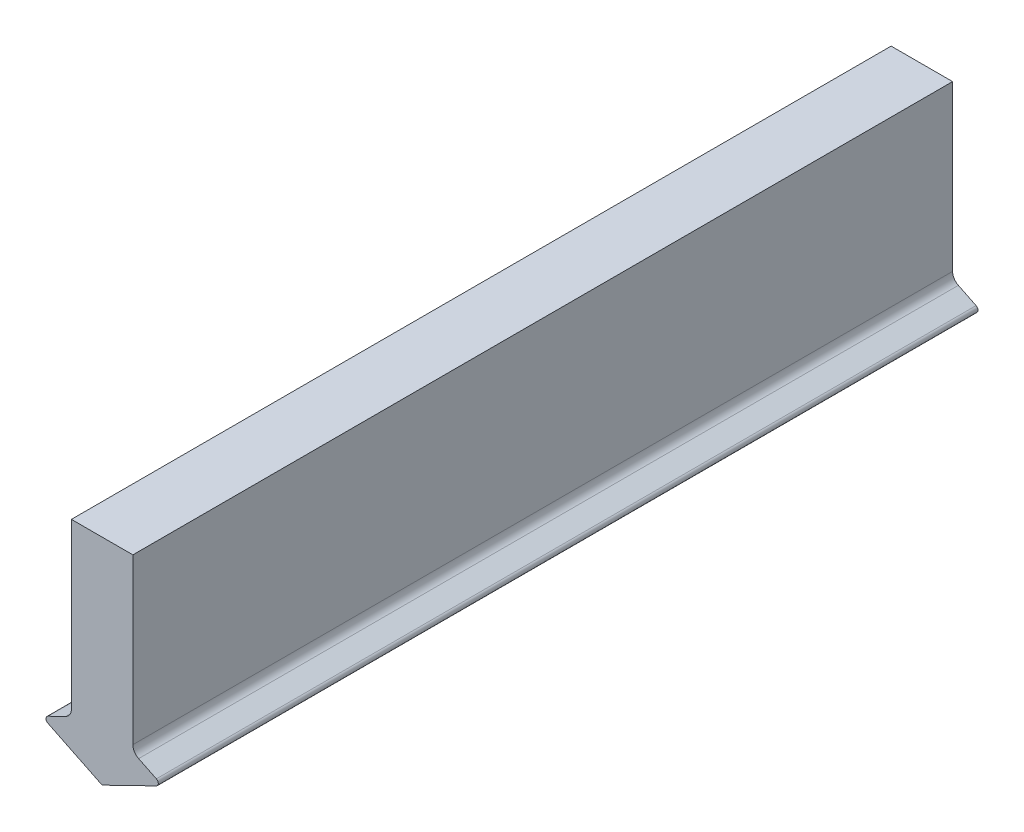
ISO-10303-21;
HEADER;
FILE_DESCRIPTION(('STEP AP214'),'2;1');
FILE_NAME('part.step','',(''),(''),'','','');
FILE_SCHEMA(('AUTOMOTIVE_DESIGN { 1 0 10303 214 1 1 1 1 }'));
ENDSEC;
DATA;
#1=APPLICATION_CONTEXT('core data for automotive mechanical design processes');
#2=APPLICATION_PROTOCOL_DEFINITION('international standard','automotive_design',2000,#1);
#3=PRODUCT_CONTEXT('',#1,'mechanical');
#4=PRODUCT('Part','Part','',(#3));
#5=PRODUCT_RELATED_PRODUCT_CATEGORY('part','',(#4));
#6=PRODUCT_DEFINITION_FORMATION('','',#4);
#7=PRODUCT_DEFINITION_CONTEXT('part definition',#1,'design');
#8=PRODUCT_DEFINITION('design','',#6,#7);
#9=PRODUCT_DEFINITION_SHAPE('','',#8);
#10=(LENGTH_UNIT() NAMED_UNIT(*) SI_UNIT(.MILLI.,.METRE.));
#11=(NAMED_UNIT(*) PLANE_ANGLE_UNIT() SI_UNIT($,.RADIAN.));
#12=(NAMED_UNIT(*) SI_UNIT($,.STERADIAN.) SOLID_ANGLE_UNIT());
#13=UNCERTAINTY_MEASURE_WITH_UNIT(LENGTH_MEASURE(1.E-05),#10,'distance_accuracy_value','');
#14=(GEOMETRIC_REPRESENTATION_CONTEXT(3) GLOBAL_UNCERTAINTY_ASSIGNED_CONTEXT((#13)) GLOBAL_UNIT_ASSIGNED_CONTEXT((#10,
#11,#12)) REPRESENTATION_CONTEXT('',''));
#15=CARTESIAN_POINT('',(0.,0.,0.));
#16=DIRECTION('',(0.,0.,1.));
#17=DIRECTION('',(1.,0.,0.));
#18=AXIS2_PLACEMENT_3D('',#15,#16,#17);
#19=CARTESIAN_POINT('',(3.17520498856519,1.54865094830014,48.));
#20=DIRECTION('',(-0.438371146789078,0.898794046299166,0.));
#21=DIRECTION('',(-0.898794046299167,-0.438371146789078,0.));
#22=AXIS2_PLACEMENT_3D('',#19,#20,#21);
#23=PLANE('',#22);
#24=DIRECTION('',(0.898794046299167,0.438371146789078,0.));
#25=VECTOR('',#24,1.);
#26=CARTESIAN_POINT('',(3.17520498856519,1.54865094830014,0.));
#27=LINE('',#26,#25);
#28=CARTESIAN_POINT('',(0.,0.,0.));
#29=VERTEX_POINT('',#28);
#30=CARTESIAN_POINT('',(3.17520498856519,1.54865094830014,0.));
#31=VERTEX_POINT('',#30);
#32=EDGE_CURVE('E150',#29,#31,#27,.T.);
#33=ORIENTED_EDGE('',*,*,#32,.T.);
#34=DIRECTION('',(0.,0.,-1.));
#35=VECTOR('',#34,1.);
#36=CARTESIAN_POINT('',(3.17520498856519,1.54865094830014,48.));
#37=LINE('',#36,#35);
#38=CARTESIAN_POINT('',(3.17520498856519,1.54865094830014,48.));
#39=VERTEX_POINT('',#38);
#40=EDGE_CURVE('E11',#39,#31,#37,.T.);
#41=ORIENTED_EDGE('',*,*,#40,.F.);
#42=DIRECTION('',(0.898794046299167,0.438371146789078,0.));
#43=VECTOR('',#42,1.);
#44=CARTESIAN_POINT('',(3.17520498856519,1.54865094830014,48.));
#45=LINE('',#44,#43);
#46=CARTESIAN_POINT('',(0.,0.,48.));
#47=VERTEX_POINT('',#46);
#48=EDGE_CURVE('E170',#47,#39,#45,.T.);
#49=ORIENTED_EDGE('',*,*,#48,.F.);
#50=DIRECTION('',(0.,0.,-1.));
#51=VECTOR('',#50,1.);
#52=CARTESIAN_POINT('',(0.,0.,48.));
#53=LINE('',#52,#51);
#54=EDGE_CURVE('E146',#47,#29,#53,.T.);
#55=ORIENTED_EDGE('',*,*,#54,.T.);
#56=EDGE_LOOP('',(#33,#41,#49,#55));
#57=FACE_BOUND('',#56,.T.);
#58=ADVANCED_FACE('F36',(#57),#23,.F.);
#59=CARTESIAN_POINT('',(3.08753075920738,1.72840975755998,48.));
#60=DIRECTION('',(0.,0.,-1.));
#61=DIRECTION('',(-1.,0.,0.));
#62=AXIS2_PLACEMENT_3D('',#59,#60,#61);
#63=CYLINDRICAL_SURFACE('',#62,0.2);
#64=CARTESIAN_POINT('',(3.08753075920738,1.72840975755998,0.));
#65=DIRECTION('',(0.,0.,1.));
#66=DIRECTION('',(1.,0.,0.));
#67=AXIS2_PLACEMENT_3D('',#64,#65,#66);
#68=CIRCLE('',#67,0.2);
#69=CARTESIAN_POINT('',(3.17520498856519,1.90816856681981,0.));
#70=VERTEX_POINT('',#69);
#71=EDGE_CURVE('E153',#31,#70,#68,.T.);
#72=ORIENTED_EDGE('',*,*,#71,.T.);
#73=DIRECTION('',(0.,0.,-1.));
#74=VECTOR('',#73,1.);
#75=CARTESIAN_POINT('',(3.17520498856519,1.90816856681981,48.));
#76=LINE('',#75,#74);
#77=CARTESIAN_POINT('',(3.17520498856519,1.90816856681981,48.));
#78=VERTEX_POINT('',#77);
#79=EDGE_CURVE('E44',#78,#70,#76,.T.);
#80=ORIENTED_EDGE('',*,*,#79,.F.);
#81=CARTESIAN_POINT('',(3.08753075920738,1.72840975755998,48.));
#82=DIRECTION('',(0.,0.,1.));
#83=DIRECTION('',(1.,0.,0.));
#84=AXIS2_PLACEMENT_3D('',#81,#82,#83);
#85=CIRCLE('',#84,0.2);
#86=EDGE_CURVE('E104',#39,#78,#85,.T.);
#87=ORIENTED_EDGE('',*,*,#86,.F.);
#88=ORIENTED_EDGE('',*,*,#40,.T.);
#89=EDGE_LOOP('',(#72,#80,#87,#88));
#90=FACE_BOUND('',#89,.T.);
#91=ADVANCED_FACE('F242',(#90),#63,.T.);
#92=CARTESIAN_POINT('',(2.13697686895111,2.41454625512105,48.));
#93=DIRECTION('',(-0.438371146789073,-0.898794046299169,0.));
#94=DIRECTION('',(0.898794046299169,-0.438371146789073,0.));
#95=AXIS2_PLACEMENT_3D('',#92,#93,#94);
#96=PLANE('',#95);
#97=DIRECTION('',(-0.898794046299169,0.438371146789073,0.));
#98=VECTOR('',#97,1.);
#99=CARTESIAN_POINT('',(2.13697686895111,2.41454625512105,0.));
#100=LINE('',#99,#98);
#101=CARTESIAN_POINT('',(2.13697686895111,2.41454625512105,0.));
#102=VERTEX_POINT('',#101);
#103=EDGE_CURVE('E155',#70,#102,#100,.T.);
#104=ORIENTED_EDGE('',*,*,#103,.T.);
#105=DIRECTION('',(0.,0.,-1.));
#106=VECTOR('',#105,1.);
#107=CARTESIAN_POINT('',(2.13697686895111,2.41454625512105,48.));
#108=LINE('',#107,#106);
#109=CARTESIAN_POINT('',(2.13697686895111,2.41454625512105,48.));
#110=VERTEX_POINT('',#109);
#111=EDGE_CURVE('E186',#110,#102,#108,.T.);
#112=ORIENTED_EDGE('',*,*,#111,.F.);
#113=DIRECTION('',(-0.898794046299169,0.438371146789073,0.));
#114=VECTOR('',#113,1.);
#115=CARTESIAN_POINT('',(2.13697686895111,2.41454625512105,48.));
#116=LINE('',#115,#114);
#117=EDGE_CURVE('E194',#78,#110,#116,.T.);
#118=ORIENTED_EDGE('',*,*,#117,.F.);
#119=ORIENTED_EDGE('',*,*,#79,.T.);
#120=EDGE_LOOP('',(#104,#112,#118,#119));
#121=FACE_BOUND('',#120,.T.);
#122=ADVANCED_FACE('F192',(#121),#96,.F.);
#123=CARTESIAN_POINT('',(2.39999955702455,2.95382268290055,48.));
#124=DIRECTION('',(0.,0.,-1.));
#125=DIRECTION('',(-1.,0.,0.));
#126=AXIS2_PLACEMENT_3D('',#123,#124,#125);
#127=CYLINDRICAL_SURFACE('',#126,0.6);
#128=CARTESIAN_POINT('',(2.39999955702455,2.95382268290055,0.));
#129=DIRECTION('',(0.,0.,-1.));
#130=DIRECTION('',(-1.,0.,0.));
#131=AXIS2_PLACEMENT_3D('',#128,#129,#130);
#132=CIRCLE('',#131,0.6);
#133=CARTESIAN_POINT('',(1.79999955702455,2.95382268290055,0.));
#134=VERTEX_POINT('',#133);
#135=EDGE_CURVE('E157',#102,#134,#132,.T.);
#136=ORIENTED_EDGE('',*,*,#135,.T.);
#137=DIRECTION('',(0.,0.,-1.));
#138=VECTOR('',#137,1.);
#139=CARTESIAN_POINT('',(1.79999955702455,2.95382268290055,48.));
#140=LINE('',#139,#138);
#141=CARTESIAN_POINT('',(1.79999955702455,2.95382268290055,48.));
#142=VERTEX_POINT('',#141);
#143=EDGE_CURVE('E183',#142,#134,#140,.T.);
#144=ORIENTED_EDGE('',*,*,#143,.F.);
#145=CARTESIAN_POINT('',(2.39999955702455,2.95382268290055,48.));
#146=DIRECTION('',(0.,0.,-1.));
#147=DIRECTION('',(-1.,0.,0.));
#148=AXIS2_PLACEMENT_3D('',#145,#146,#147);
#149=CIRCLE('',#148,0.6);
#150=EDGE_CURVE('E212',#110,#142,#149,.T.);
#151=ORIENTED_EDGE('',*,*,#150,.F.);
#152=ORIENTED_EDGE('',*,*,#111,.T.);
#153=EDGE_LOOP('',(#136,#144,#151,#152));
#154=FACE_BOUND('',#153,.T.);
#155=ADVANCED_FACE('F203',(#154),#127,.F.);
#156=CARTESIAN_POINT('',(1.79999955702455,12.578901071755,48.));
#157=DIRECTION('',(-1.,0.,0.));
#158=DIRECTION('',(0.,0.,1.));
#159=AXIS2_PLACEMENT_3D('',#156,#157,#158);
#160=PLANE('',#159);
#161=DIRECTION('',(0.,1.,0.));
#162=VECTOR('',#161,1.);
#163=CARTESIAN_POINT('',(1.79999955702455,12.578901071755,0.));
#164=LINE('',#163,#162);
#165=CARTESIAN_POINT('',(1.79999955702455,12.578901071755,0.));
#166=VERTEX_POINT('',#165);
#167=EDGE_CURVE('E159',#134,#166,#164,.T.);
#168=ORIENTED_EDGE('',*,*,#167,.T.);
#169=DIRECTION('',(0.,0.,-1.));
#170=VECTOR('',#169,1.);
#171=CARTESIAN_POINT('',(1.79999955702455,12.578901071755,48.));
#172=LINE('',#171,#170);
#173=CARTESIAN_POINT('',(1.79999955702455,12.578901071755,48.));
#174=VERTEX_POINT('',#173);
#175=EDGE_CURVE('E180',#174,#166,#172,.T.);
#176=ORIENTED_EDGE('',*,*,#175,.F.);
#177=DIRECTION('',(0.,1.,0.));
#178=VECTOR('',#177,1.);
#179=CARTESIAN_POINT('',(1.79999955702455,12.578901071755,48.));
#180=LINE('',#179,#178);
#181=EDGE_CURVE('E209',#142,#174,#180,.T.);
#182=ORIENTED_EDGE('',*,*,#181,.F.);
#183=ORIENTED_EDGE('',*,*,#143,.T.);
#184=EDGE_LOOP('',(#168,#176,#182,#183));
#185=FACE_BOUND('',#184,.T.);
#186=ADVANCED_FACE('F207',(#185),#160,.F.);
#187=CARTESIAN_POINT('',(-1.79999955702455,12.578901071755,48.));
#188=DIRECTION('',(0.,-1.,0.));
#189=DIRECTION('',(0.,0.,-1.));
#190=AXIS2_PLACEMENT_3D('',#187,#188,#189);
#191=PLANE('',#190);
#192=DIRECTION('',(-1.,0.,0.));
#193=VECTOR('',#192,1.);
#194=CARTESIAN_POINT('',(-1.79999955702455,12.578901071755,0.));
#195=LINE('',#194,#193);
#196=CARTESIAN_POINT('',(-1.79999955702455,12.578901071755,0.));
#197=VERTEX_POINT('',#196);
#198=EDGE_CURVE('E161',#166,#197,#195,.T.);
#199=ORIENTED_EDGE('',*,*,#198,.T.);
#200=DIRECTION('',(0.,0.,-1.));
#201=VECTOR('',#200,1.);
#202=CARTESIAN_POINT('',(-1.79999955702455,12.578901071755,48.));
#203=LINE('',#202,#201);
#204=CARTESIAN_POINT('',(-1.79999955702455,12.578901071755,48.));
#205=VERTEX_POINT('',#204);
#206=EDGE_CURVE('E177',#205,#197,#203,.T.);
#207=ORIENTED_EDGE('',*,*,#206,.F.);
#208=DIRECTION('',(-1.,0.,0.));
#209=VECTOR('',#208,1.);
#210=CARTESIAN_POINT('',(-1.79999955702455,12.578901071755,48.));
#211=LINE('',#210,#209);
#212=EDGE_CURVE('E211',#174,#205,#211,.T.);
#213=ORIENTED_EDGE('',*,*,#212,.F.);
#214=ORIENTED_EDGE('',*,*,#175,.T.);
#215=EDGE_LOOP('',(#199,#207,#213,#214));
#216=FACE_BOUND('',#215,.T.);
#217=ADVANCED_FACE('F255',(#216),#191,.F.);
#218=CARTESIAN_POINT('',(-1.79999955702455,2.95382268290055,48.));
#219=DIRECTION('',(1.,0.,0.));
#220=DIRECTION('',(0.,0.,-1.));
#221=AXIS2_PLACEMENT_3D('',#218,#219,#220);
#222=PLANE('',#221);
#223=DIRECTION('',(0.,-1.,0.));
#224=VECTOR('',#223,1.);
#225=CARTESIAN_POINT('',(-1.79999955702455,2.95382268290055,0.));
#226=LINE('',#225,#224);
#227=CARTESIAN_POINT('',(-1.79999955702455,2.95382268290055,0.));
#228=VERTEX_POINT('',#227);
#229=EDGE_CURVE('E163',#197,#228,#226,.T.);
#230=ORIENTED_EDGE('',*,*,#229,.T.);
#231=DIRECTION('',(0.,0.,-1.));
#232=VECTOR('',#231,1.);
#233=CARTESIAN_POINT('',(-1.79999955702455,2.95382268290055,48.));
#234=LINE('',#233,#232);
#235=CARTESIAN_POINT('',(-1.79999955702455,2.95382268290055,48.));
#236=VERTEX_POINT('',#235);
#237=EDGE_CURVE('E174',#236,#228,#234,.T.);
#238=ORIENTED_EDGE('',*,*,#237,.F.);
#239=DIRECTION('',(0.,-1.,0.));
#240=VECTOR('',#239,1.);
#241=CARTESIAN_POINT('',(-1.79999955702455,2.95382268290055,48.));
#242=LINE('',#241,#240);
#243=EDGE_CURVE('E214',#205,#236,#242,.T.);
#244=ORIENTED_EDGE('',*,*,#243,.F.);
#245=ORIENTED_EDGE('',*,*,#206,.T.);
#246=EDGE_LOOP('',(#230,#238,#244,#245));
#247=FACE_BOUND('',#246,.T.);
#248=ADVANCED_FACE('F223',(#247),#222,.F.);
#249=CARTESIAN_POINT('',(-2.39999955702455,2.95382268290055,48.));
#250=DIRECTION('',(0.,0.,-1.));
#251=DIRECTION('',(-1.,0.,0.));
#252=AXIS2_PLACEMENT_3D('',#249,#250,#251);
#253=CYLINDRICAL_SURFACE('',#252,0.6);
#254=CARTESIAN_POINT('',(-2.39999955702455,2.95382268290055,0.));
#255=DIRECTION('',(0.,0.,-1.));
#256=DIRECTION('',(1.,0.,0.));
#257=AXIS2_PLACEMENT_3D('',#254,#255,#256);
#258=CIRCLE('',#257,0.6);
#259=CARTESIAN_POINT('',(-2.13697686895111,2.41454625512105,0.));
#260=VERTEX_POINT('',#259);
#261=EDGE_CURVE('E165',#228,#260,#258,.T.);
#262=ORIENTED_EDGE('',*,*,#261,.T.);
#263=DIRECTION('',(0.,0.,-1.));
#264=VECTOR('',#263,1.);
#265=CARTESIAN_POINT('',(-2.13697686895111,2.41454625512105,48.));
#266=LINE('',#265,#264);
#267=CARTESIAN_POINT('',(-2.13697686895111,2.41454625512105,48.));
#268=VERTEX_POINT('',#267);
#269=EDGE_CURVE('E141',#268,#260,#266,.T.);
#270=ORIENTED_EDGE('',*,*,#269,.F.);
#271=CARTESIAN_POINT('',(-2.39999955702455,2.95382268290055,48.));
#272=DIRECTION('',(0.,0.,-1.));
#273=DIRECTION('',(1.,0.,0.));
#274=AXIS2_PLACEMENT_3D('',#271,#272,#273);
#275=CIRCLE('',#274,0.6);
#276=EDGE_CURVE('E132',#236,#268,#275,.T.);
#277=ORIENTED_EDGE('',*,*,#276,.F.);
#278=ORIENTED_EDGE('',*,*,#237,.T.);
#279=EDGE_LOOP('',(#262,#270,#277,#278));
#280=FACE_BOUND('',#279,.T.);
#281=ADVANCED_FACE('F227',(#280),#253,.F.);
#282=CARTESIAN_POINT('',(-3.17520498856519,1.90816856681981,48.));
#283=DIRECTION('',(0.438371146789073,-0.898794046299169,0.));
#284=DIRECTION('',(0.898794046299169,0.438371146789073,0.));
#285=AXIS2_PLACEMENT_3D('',#282,#283,#284);
#286=PLANE('',#285);
#287=DIRECTION('',(-0.898794046299169,-0.438371146789073,0.));
#288=VECTOR('',#287,1.);
#289=CARTESIAN_POINT('',(-3.17520498856519,1.90816856681981,0.));
#290=LINE('',#289,#288);
#291=CARTESIAN_POINT('',(-3.17520498856519,1.90816856681981,0.));
#292=VERTEX_POINT('',#291);
#293=EDGE_CURVE('E140',#260,#292,#290,.T.);
#294=ORIENTED_EDGE('',*,*,#293,.T.);
#295=DIRECTION('',(0.,0.,-1.));
#296=VECTOR('',#295,1.);
#297=CARTESIAN_POINT('',(-3.17520498856519,1.90816856681981,48.));
#298=LINE('',#297,#296);
#299=CARTESIAN_POINT('',(-3.17520498856519,1.90816856681981,48.));
#300=VERTEX_POINT('',#299);
#301=EDGE_CURVE('E137',#300,#292,#298,.T.);
#302=ORIENTED_EDGE('',*,*,#301,.F.);
#303=DIRECTION('',(-0.898794046299169,-0.438371146789073,0.));
#304=VECTOR('',#303,1.);
#305=CARTESIAN_POINT('',(-3.17520498856519,1.90816856681981,48.));
#306=LINE('',#305,#304);
#307=EDGE_CURVE('E126',#268,#300,#306,.T.);
#308=ORIENTED_EDGE('',*,*,#307,.F.);
#309=ORIENTED_EDGE('',*,*,#269,.T.);
#310=EDGE_LOOP('',(#294,#302,#308,#309));
#311=FACE_BOUND('',#310,.T.);
#312=ADVANCED_FACE('F138',(#311),#286,.F.);
#313=CARTESIAN_POINT('',(-3.08753075920738,1.72840975755998,48.));
#314=DIRECTION('',(0.,0.,-1.));
#315=DIRECTION('',(-1.,0.,0.));
#316=AXIS2_PLACEMENT_3D('',#313,#314,#315);
#317=CYLINDRICAL_SURFACE('',#316,0.2);
#318=CARTESIAN_POINT('',(-3.08753075920738,1.72840975755998,0.));
#319=DIRECTION('',(0.,0.,1.));
#320=DIRECTION('',(1.,0.,0.));
#321=AXIS2_PLACEMENT_3D('',#318,#319,#320);
#322=CIRCLE('',#321,0.2);
#323=CARTESIAN_POINT('',(-3.17520498856519,1.54865094830014,0.));
#324=VERTEX_POINT('',#323);
#325=EDGE_CURVE('E90',#292,#324,#322,.T.);
#326=ORIENTED_EDGE('',*,*,#325,.T.);
#327=DIRECTION('',(0.,0.,-1.));
#328=VECTOR('',#327,1.);
#329=CARTESIAN_POINT('',(-3.17520498856519,1.54865094830014,48.));
#330=LINE('',#329,#328);
#331=CARTESIAN_POINT('',(-3.17520498856519,1.54865094830014,48.));
#332=VERTEX_POINT('',#331);
#333=EDGE_CURVE('E142',#332,#324,#330,.T.);
#334=ORIENTED_EDGE('',*,*,#333,.F.);
#335=CARTESIAN_POINT('',(-3.08753075920738,1.72840975755998,48.));
#336=DIRECTION('',(0.,0.,1.));
#337=DIRECTION('',(1.,0.,0.));
#338=AXIS2_PLACEMENT_3D('',#335,#336,#337);
#339=CIRCLE('',#338,0.2);
#340=EDGE_CURVE('E130',#300,#332,#339,.T.);
#341=ORIENTED_EDGE('',*,*,#340,.F.);
#342=ORIENTED_EDGE('',*,*,#301,.T.);
#343=EDGE_LOOP('',(#326,#334,#341,#342));
#344=FACE_BOUND('',#343,.T.);
#345=ADVANCED_FACE('F144',(#344),#317,.T.);
#346=CARTESIAN_POINT('',(0.,0.,48.));
#347=DIRECTION('',(0.438371146789078,0.898794046299166,0.));
#348=DIRECTION('',(-0.898794046299167,0.438371146789078,0.));
#349=AXIS2_PLACEMENT_3D('',#346,#347,#348);
#350=PLANE('',#349);
#351=DIRECTION('',(0.898794046299167,-0.438371146789078,0.));
#352=VECTOR('',#351,1.);
#353=CARTESIAN_POINT('',(0.,0.,0.));
#354=LINE('',#353,#352);
#355=EDGE_CURVE('E96',#324,#29,#354,.T.);
#356=ORIENTED_EDGE('',*,*,#355,.T.);
#357=ORIENTED_EDGE('',*,*,#54,.F.);
#358=DIRECTION('',(0.898794046299167,-0.438371146789078,0.));
#359=VECTOR('',#358,1.);
#360=CARTESIAN_POINT('',(0.,0.,48.));
#361=LINE('',#360,#359);
#362=EDGE_CURVE('E52',#332,#47,#361,.T.);
#363=ORIENTED_EDGE('',*,*,#362,.F.);
#364=ORIENTED_EDGE('',*,*,#333,.T.);
#365=EDGE_LOOP('',(#356,#357,#363,#364));
#366=FACE_BOUND('',#365,.T.);
#367=ADVANCED_FACE('F231',(#366),#350,.F.);
#368=CARTESIAN_POINT('',(-3.08753075920738,1.72840975755998,48.));
#369=DIRECTION('',(0.,0.,1.));
#370=DIRECTION('',(1.,0.,0.));
#371=AXIS2_PLACEMENT_3D('',#368,#369,#370);
#372=PLANE('',#371);
#373=ORIENTED_EDGE('',*,*,#48,.T.);
#374=ORIENTED_EDGE('',*,*,#86,.T.);
#375=ORIENTED_EDGE('',*,*,#117,.T.);
#376=ORIENTED_EDGE('',*,*,#150,.T.);
#377=ORIENTED_EDGE('',*,*,#181,.T.);
#378=ORIENTED_EDGE('',*,*,#212,.T.);
#379=ORIENTED_EDGE('',*,*,#243,.T.);
#380=ORIENTED_EDGE('',*,*,#276,.T.);
#381=ORIENTED_EDGE('',*,*,#307,.T.);
#382=ORIENTED_EDGE('',*,*,#340,.T.);
#383=ORIENTED_EDGE('',*,*,#362,.T.);
#384=EDGE_LOOP('',(#373,#374,#375,#376,#377,#378,#379,#380,#381,#382,#383));
#385=FACE_BOUND('',#384,.T.);
#386=ADVANCED_FACE('F128',(#385),#372,.T.);
#387=CARTESIAN_POINT('',(-3.08753075920738,1.72840975755998,0.));
#388=DIRECTION('',(0.,0.,1.));
#389=DIRECTION('',(1.,0.,0.));
#390=AXIS2_PLACEMENT_3D('',#387,#388,#389);
#391=PLANE('',#390);
#392=ORIENTED_EDGE('',*,*,#32,.F.);
#393=ORIENTED_EDGE('',*,*,#355,.F.);
#394=ORIENTED_EDGE('',*,*,#325,.F.);
#395=ORIENTED_EDGE('',*,*,#293,.F.);
#396=ORIENTED_EDGE('',*,*,#261,.F.);
#397=ORIENTED_EDGE('',*,*,#229,.F.);
#398=ORIENTED_EDGE('',*,*,#198,.F.);
#399=ORIENTED_EDGE('',*,*,#167,.F.);
#400=ORIENTED_EDGE('',*,*,#135,.F.);
#401=ORIENTED_EDGE('',*,*,#103,.F.);
#402=ORIENTED_EDGE('',*,*,#71,.F.);
#403=EDGE_LOOP('',(#392,#393,#394,#395,#396,#397,#398,#399,#400,#401,#402));
#404=FACE_BOUND('',#403,.T.);
#405=ADVANCED_FACE('F198',(#404),#391,.F.);
#406=CLOSED_SHELL('',(#58,#91,#122,#155,#186,#217,#248,#281,#312,#345,#367,#386,#405));
#407=MANIFOLD_SOLID_BREP('B2',#406);
#408=ADVANCED_BREP_SHAPE_REPRESENTATION('',(#18,#407),#14);
#409=SHAPE_DEFINITION_REPRESENTATION(#9,#408);
ENDSEC;
END-ISO-10303-21;
